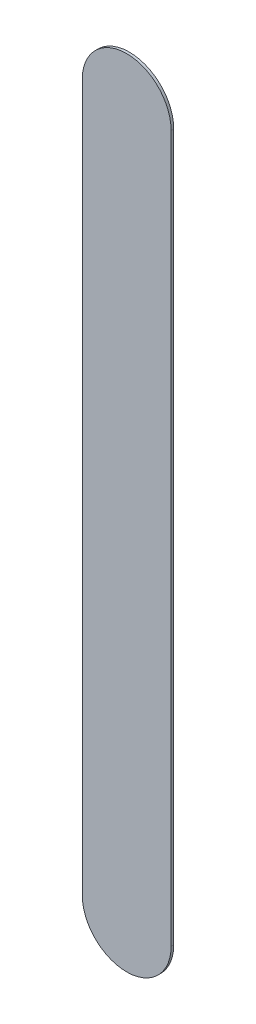
ISO-10303-21;
HEADER;
FILE_DESCRIPTION(('STEP AP214'),'2;1');
FILE_NAME('part.step','',(''),(''),'','','');
FILE_SCHEMA(('AUTOMOTIVE_DESIGN { 1 0 10303 214 1 1 1 1 }'));
ENDSEC;
DATA;
#1=APPLICATION_CONTEXT('core data for automotive mechanical design processes');
#2=APPLICATION_PROTOCOL_DEFINITION('international standard','automotive_design',2000,#1);
#3=PRODUCT_CONTEXT('',#1,'mechanical');
#4=PRODUCT('Part','Part','',(#3));
#5=PRODUCT_RELATED_PRODUCT_CATEGORY('part','',(#4));
#6=PRODUCT_DEFINITION_FORMATION('','',#4);
#7=PRODUCT_DEFINITION_CONTEXT('part definition',#1,'design');
#8=PRODUCT_DEFINITION('design','',#6,#7);
#9=PRODUCT_DEFINITION_SHAPE('','',#8);
#10=(LENGTH_UNIT() NAMED_UNIT(*) SI_UNIT(.MILLI.,.METRE.));
#11=(NAMED_UNIT(*) PLANE_ANGLE_UNIT() SI_UNIT($,.RADIAN.));
#12=(NAMED_UNIT(*) SI_UNIT($,.STERADIAN.) SOLID_ANGLE_UNIT());
#13=UNCERTAINTY_MEASURE_WITH_UNIT(LENGTH_MEASURE(1.E-05),#10,'distance_accuracy_value','');
#14=(GEOMETRIC_REPRESENTATION_CONTEXT(3) GLOBAL_UNCERTAINTY_ASSIGNED_CONTEXT((#13)) GLOBAL_UNIT_ASSIGNED_CONTEXT((#10,
#11,#12)) REPRESENTATION_CONTEXT('',''));
#15=CARTESIAN_POINT('',(0.,0.,0.));
#16=DIRECTION('',(0.,0.,1.));
#17=DIRECTION('',(1.,0.,0.));
#18=AXIS2_PLACEMENT_3D('',#15,#16,#17);
#19=CARTESIAN_POINT('',(33.5000092,58.960004,0.));
#20=DIRECTION('',(-1.,0.,0.));
#21=DIRECTION('',(0.,1.,0.));
#22=AXIS2_PLACEMENT_3D('',#19,#20,#21);
#23=PLANE('',#22);
#24=DIRECTION('',(0.,1.,0.));
#25=VECTOR('',#24,1.);
#26=CARTESIAN_POINT('',(33.5000092,58.960004,0.03556));
#27=LINE('',#26,#25);
#28=CARTESIAN_POINT('',(33.5000092,58.960004,0.03556));
#29=VERTEX_POINT('',#28);
#30=CARTESIAN_POINT('',(33.5000092,68.49999,0.03556));
#31=VERTEX_POINT('',#30);
#32=EDGE_CURVE('E11',#29,#31,#27,.T.);
#33=ORIENTED_EDGE('',*,*,#32,.F.);
#34=DIRECTION('',(0.,0.,1.));
#35=VECTOR('',#34,1.);
#36=CARTESIAN_POINT('',(33.5000092,58.960004,0.));
#37=LINE('',#36,#35);
#38=CARTESIAN_POINT('',(33.5000092,58.960004,0.));
#39=VERTEX_POINT('',#38);
#40=EDGE_CURVE('E24',#39,#29,#37,.T.);
#41=ORIENTED_EDGE('',*,*,#40,.F.);
#42=DIRECTION('',(0.,1.,0.));
#43=VECTOR('',#42,1.);
#44=CARTESIAN_POINT('',(33.5000092,58.960004,0.));
#45=LINE('',#44,#43);
#46=CARTESIAN_POINT('',(33.5000092,68.49999,0.));
#47=VERTEX_POINT('',#46);
#48=EDGE_CURVE('E75',#39,#47,#45,.T.);
#49=ORIENTED_EDGE('',*,*,#48,.T.);
#50=DIRECTION('',(0.,0.,1.));
#51=VECTOR('',#50,1.);
#52=CARTESIAN_POINT('',(33.5000092,68.49999,0.));
#53=LINE('',#52,#51);
#54=EDGE_CURVE('E37',#47,#31,#53,.T.);
#55=ORIENTED_EDGE('',*,*,#54,.T.);
#56=EDGE_LOOP('',(#33,#41,#49,#55));
#57=FACE_BOUND('',#56,.T.);
#58=ADVANCED_FACE('F17',(#57),#23,.F.);
#59=CARTESIAN_POINT('',(32.9000104,68.49999,0.));
#60=DIRECTION('',(0.,0.,-1.));
#61=DIRECTION('',(1.,0.,0.));
#62=AXIS2_PLACEMENT_3D('',#59,#60,#61);
#63=CYLINDRICAL_SURFACE('',#62,0.599998800000004);
#64=CARTESIAN_POINT('',(32.9000104,68.49999,0.03556));
#65=DIRECTION('',(0.,0.,1.));
#66=DIRECTION('',(1.,0.,0.));
#67=AXIS2_PLACEMENT_3D('',#64,#65,#66);
#68=CIRCLE('',#67,0.599998800000004);
#69=CARTESIAN_POINT('',(32.3000116,68.49999,0.03556));
#70=VERTEX_POINT('',#69);
#71=EDGE_CURVE('E83',#31,#70,#68,.T.);
#72=ORIENTED_EDGE('',*,*,#71,.F.);
#73=ORIENTED_EDGE('',*,*,#54,.F.);
#74=CARTESIAN_POINT('',(32.9000104,68.49999,0.));
#75=DIRECTION('',(0.,0.,1.));
#76=DIRECTION('',(1.,0.,0.));
#77=AXIS2_PLACEMENT_3D('',#74,#75,#76);
#78=CIRCLE('',#77,0.599998800000004);
#79=CARTESIAN_POINT('',(32.3000116,68.49999,0.));
#80=VERTEX_POINT('',#79);
#81=EDGE_CURVE('E81',#47,#80,#78,.T.);
#82=ORIENTED_EDGE('',*,*,#81,.T.);
#83=DIRECTION('',(0.,0.,1.));
#84=VECTOR('',#83,1.);
#85=CARTESIAN_POINT('',(32.3000116,68.49999,0.));
#86=LINE('',#85,#84);
#87=EDGE_CURVE('E67',#80,#70,#86,.T.);
#88=ORIENTED_EDGE('',*,*,#87,.T.);
#89=EDGE_LOOP('',(#72,#73,#82,#88));
#90=FACE_BOUND('',#89,.T.);
#91=ADVANCED_FACE('F89',(#90),#63,.T.);
#92=CARTESIAN_POINT('',(32.3000116,68.49999,0.));
#93=DIRECTION('',(1.,0.,0.));
#94=DIRECTION('',(0.,-1.,0.));
#95=AXIS2_PLACEMENT_3D('',#92,#93,#94);
#96=PLANE('',#95);
#97=DIRECTION('',(0.,-1.,0.));
#98=VECTOR('',#97,1.);
#99=CARTESIAN_POINT('',(32.3000116,68.49999,0.03556));
#100=LINE('',#99,#98);
#101=CARTESIAN_POINT('',(32.3000116,58.960004,0.03556));
#102=VERTEX_POINT('',#101);
#103=EDGE_CURVE('E71',#70,#102,#100,.T.);
#104=ORIENTED_EDGE('',*,*,#103,.F.);
#105=ORIENTED_EDGE('',*,*,#87,.F.);
#106=DIRECTION('',(0.,-1.,0.));
#107=VECTOR('',#106,1.);
#108=CARTESIAN_POINT('',(32.3000116,68.49999,0.));
#109=LINE('',#108,#107);
#110=CARTESIAN_POINT('',(32.3000116,58.960004,0.));
#111=VERTEX_POINT('',#110);
#112=EDGE_CURVE('E63',#80,#111,#109,.T.);
#113=ORIENTED_EDGE('',*,*,#112,.T.);
#114=DIRECTION('',(0.,0.,1.));
#115=VECTOR('',#114,1.);
#116=CARTESIAN_POINT('',(32.3000116,58.960004,0.));
#117=LINE('',#116,#115);
#118=EDGE_CURVE('E53',#111,#102,#117,.T.);
#119=ORIENTED_EDGE('',*,*,#118,.T.);
#120=EDGE_LOOP('',(#104,#105,#113,#119));
#121=FACE_BOUND('',#120,.T.);
#122=ADVANCED_FACE('F66',(#121),#96,.F.);
#123=CARTESIAN_POINT('',(32.9000104,58.960004,0.));
#124=DIRECTION('',(0.,0.,-1.));
#125=DIRECTION('',(-1.,0.,0.));
#126=AXIS2_PLACEMENT_3D('',#123,#124,#125);
#127=CYLINDRICAL_SURFACE('',#126,0.599998800000002);
#128=CARTESIAN_POINT('',(32.9000104,58.960004,0.03556));
#129=DIRECTION('',(0.,0.,1.));
#130=DIRECTION('',(-1.,0.,0.));
#131=AXIS2_PLACEMENT_3D('',#128,#129,#130);
#132=CIRCLE('',#131,0.599998800000002);
#133=EDGE_CURVE('E59',#102,#29,#132,.T.);
#134=ORIENTED_EDGE('',*,*,#133,.F.);
#135=ORIENTED_EDGE('',*,*,#118,.F.);
#136=CARTESIAN_POINT('',(32.9000104,58.960004,0.));
#137=DIRECTION('',(0.,0.,1.));
#138=DIRECTION('',(-1.,0.,0.));
#139=AXIS2_PLACEMENT_3D('',#136,#137,#138);
#140=CIRCLE('',#139,0.599998800000002);
#141=EDGE_CURVE('E57',#111,#39,#140,.T.);
#142=ORIENTED_EDGE('',*,*,#141,.T.);
#143=ORIENTED_EDGE('',*,*,#40,.T.);
#144=EDGE_LOOP('',(#134,#135,#142,#143));
#145=FACE_BOUND('',#144,.T.);
#146=ADVANCED_FACE('F55',(#145),#127,.T.);
#147=CARTESIAN_POINT('',(33.5000092,58.960004,0.));
#148=DIRECTION('',(0.,0.,-1.));
#149=DIRECTION('',(-1.,0.,0.));
#150=AXIS2_PLACEMENT_3D('',#147,#148,#149);
#151=PLANE('',#150);
#152=ORIENTED_EDGE('',*,*,#141,.F.);
#153=ORIENTED_EDGE('',*,*,#112,.F.);
#154=ORIENTED_EDGE('',*,*,#81,.F.);
#155=ORIENTED_EDGE('',*,*,#48,.F.);
#156=EDGE_LOOP('',(#152,#153,#154,#155));
#157=FACE_BOUND('',#156,.T.);
#158=ADVANCED_FACE('F74',(#157),#151,.T.);
#159=CARTESIAN_POINT('',(33.5000092,58.960004,0.03556));
#160=DIRECTION('',(0.,0.,-1.));
#161=DIRECTION('',(-1.,0.,0.));
#162=AXIS2_PLACEMENT_3D('',#159,#160,#161);
#163=PLANE('',#162);
#164=ORIENTED_EDGE('',*,*,#32,.T.);
#165=ORIENTED_EDGE('',*,*,#71,.T.);
#166=ORIENTED_EDGE('',*,*,#103,.T.);
#167=ORIENTED_EDGE('',*,*,#133,.T.);
#168=EDGE_LOOP('',(#164,#165,#166,#167));
#169=FACE_BOUND('',#168,.T.);
#170=ADVANCED_FACE('F91',(#169),#163,.F.);
#171=CLOSED_SHELL('',(#58,#91,#122,#146,#158,#170));
#172=MANIFOLD_SOLID_BREP('B1',#171);
#173=ADVANCED_BREP_SHAPE_REPRESENTATION('',(#18,#172),#14);
#174=SHAPE_DEFINITION_REPRESENTATION(#9,#173);
ENDSEC;
END-ISO-10303-21;
